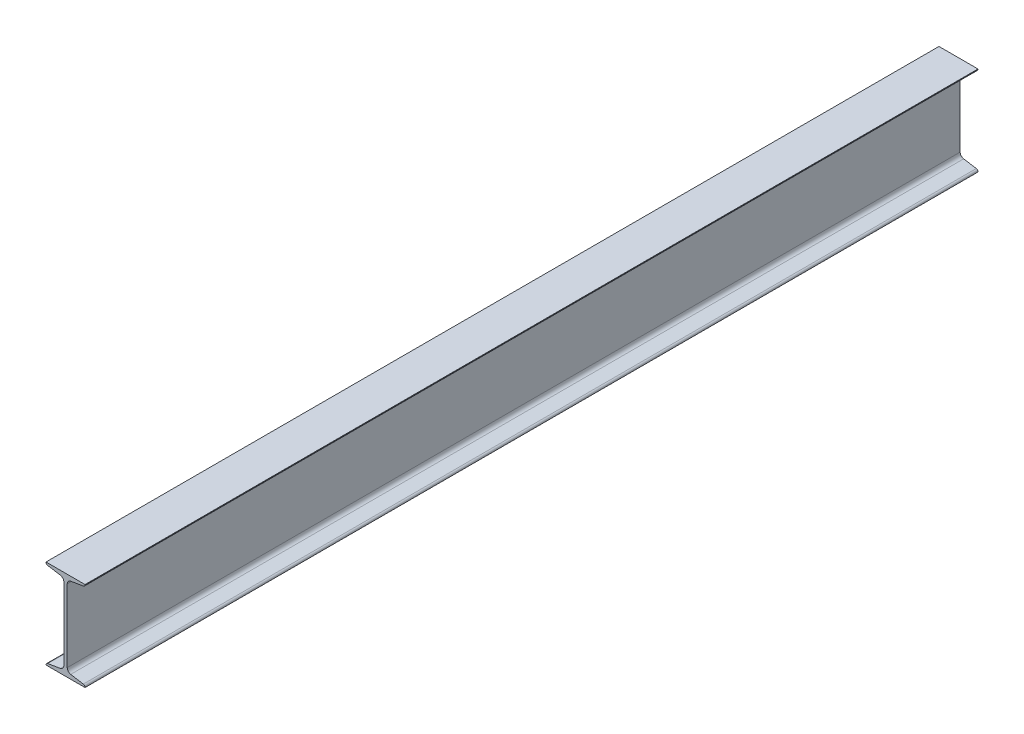
ISO-10303-21;
HEADER;
FILE_DESCRIPTION(('STEP AP214'),'2;1');
FILE_NAME('part.step','',(''),(''),'','','');
FILE_SCHEMA(('AUTOMOTIVE_DESIGN { 1 0 10303 214 1 1 1 1 }'));
ENDSEC;
DATA;
#1=APPLICATION_CONTEXT('core data for automotive mechanical design processes');
#2=APPLICATION_PROTOCOL_DEFINITION('international standard','automotive_design',2000,#1);
#3=PRODUCT_CONTEXT('',#1,'mechanical');
#4=PRODUCT('Part','Part','',(#3));
#5=PRODUCT_RELATED_PRODUCT_CATEGORY('part','',(#4));
#6=PRODUCT_DEFINITION_FORMATION('','',#4);
#7=PRODUCT_DEFINITION_CONTEXT('part definition',#1,'design');
#8=PRODUCT_DEFINITION('design','',#6,#7);
#9=PRODUCT_DEFINITION_SHAPE('','',#8);
#10=(LENGTH_UNIT() NAMED_UNIT(*) SI_UNIT(.MILLI.,.METRE.));
#11=(NAMED_UNIT(*) PLANE_ANGLE_UNIT() SI_UNIT($,.RADIAN.));
#12=(NAMED_UNIT(*) SI_UNIT($,.STERADIAN.) SOLID_ANGLE_UNIT());
#13=UNCERTAINTY_MEASURE_WITH_UNIT(LENGTH_MEASURE(1.E-05),#10,'distance_accuracy_value','');
#14=(GEOMETRIC_REPRESENTATION_CONTEXT(3) GLOBAL_UNCERTAINTY_ASSIGNED_CONTEXT((#13)) GLOBAL_UNIT_ASSIGNED_CONTEXT((#10,
#11,#12)) REPRESENTATION_CONTEXT('',''));
#15=CARTESIAN_POINT('',(0.,0.,0.));
#16=DIRECTION('',(0.,0.,1.));
#17=DIRECTION('',(1.,0.,0.));
#18=AXIS2_PLACEMENT_3D('',#15,#16,#17);
#19=CARTESIAN_POINT('',(66.6750000000003,-152.4,3050.));
#20=DIRECTION('',(0.,1.,0.));
#21=DIRECTION('',(-1.,0.,0.));
#22=AXIS2_PLACEMENT_3D('',#19,#20,#21);
#23=PLANE('',#22);
#24=DIRECTION('',(1.,0.,0.));
#25=VECTOR('',#24,1.);
#26=CARTESIAN_POINT('',(66.6750000000003,-152.4,0.));
#27=LINE('',#26,#25);
#28=CARTESIAN_POINT('',(-66.6749999999997,-152.4,0.));
#29=VERTEX_POINT('',#28);
#30=CARTESIAN_POINT('',(66.6750000000003,-152.4,0.));
#31=VERTEX_POINT('',#30);
#32=EDGE_CURVE('E209',#29,#31,#27,.T.);
#33=ORIENTED_EDGE('',*,*,#32,.T.);
#34=DIRECTION('',(0.,0.,-1.));
#35=VECTOR('',#34,1.);
#36=CARTESIAN_POINT('',(66.6750000000003,-152.4,3050.));
#37=LINE('',#36,#35);
#38=CARTESIAN_POINT('',(66.6750000000003,-152.4,3050.));
#39=VERTEX_POINT('',#38);
#40=EDGE_CURVE('E11',#39,#31,#37,.T.);
#41=ORIENTED_EDGE('',*,*,#40,.F.);
#42=DIRECTION('',(1.,0.,0.));
#43=VECTOR('',#42,1.);
#44=CARTESIAN_POINT('',(66.6750000000003,-152.4,3050.));
#45=LINE('',#44,#43);
#46=CARTESIAN_POINT('',(-66.6749999999997,-152.4,3050.));
#47=VERTEX_POINT('',#46);
#48=EDGE_CURVE('E247',#47,#39,#45,.T.);
#49=ORIENTED_EDGE('',*,*,#48,.F.);
#50=DIRECTION('',(0.,0.,-1.));
#51=VECTOR('',#50,1.);
#52=CARTESIAN_POINT('',(-66.6749999999997,-152.4,3050.));
#53=LINE('',#52,#51);
#54=EDGE_CURVE('E205',#47,#29,#53,.T.);
#55=ORIENTED_EDGE('',*,*,#54,.T.);
#56=EDGE_LOOP('',(#33,#41,#49,#55));
#57=FACE_BOUND('',#56,.T.);
#58=ADVANCED_FACE('F41',(#57),#23,.F.);
#59=CARTESIAN_POINT('',(66.6750000000003,-152.036345520012,3050.));
#60=DIRECTION('',(-1.,0.,0.));
#61=DIRECTION('',(0.,0.,1.));
#62=AXIS2_PLACEMENT_3D('',#59,#60,#61);
#63=PLANE('',#62);
#64=DIRECTION('',(0.,1.,0.));
#65=VECTOR('',#64,1.);
#66=CARTESIAN_POINT('',(66.6750000000003,-152.036345520012,0.));
#67=LINE('',#66,#65);
#68=CARTESIAN_POINT('',(66.6750000000003,-152.036345520012,0.));
#69=VERTEX_POINT('',#68);
#70=EDGE_CURVE('E212',#31,#69,#67,.T.);
#71=ORIENTED_EDGE('',*,*,#70,.T.);
#72=DIRECTION('',(0.,0.,-1.));
#73=VECTOR('',#72,1.);
#74=CARTESIAN_POINT('',(66.6750000000003,-152.036345520012,3050.));
#75=LINE('',#74,#73);
#76=CARTESIAN_POINT('',(66.6750000000003,-152.036345520012,3050.));
#77=VERTEX_POINT('',#76);
#78=EDGE_CURVE('E49',#77,#69,#75,.T.);
#79=ORIENTED_EDGE('',*,*,#78,.F.);
#80=DIRECTION('',(0.,1.,0.));
#81=VECTOR('',#80,1.);
#82=CARTESIAN_POINT('',(66.6750000000003,-152.036345520012,3050.));
#83=LINE('',#82,#81);
#84=EDGE_CURVE('E136',#39,#77,#83,.T.);
#85=ORIENTED_EDGE('',*,*,#84,.F.);
#86=ORIENTED_EDGE('',*,*,#40,.T.);
#87=EDGE_LOOP('',(#71,#79,#85,#86));
#88=FACE_BOUND('',#87,.T.);
#89=ADVANCED_FACE('F365',(#88),#63,.F.);
#90=CARTESIAN_POINT('',(59.5630000000004,-152.036345520012,3050.));
#91=DIRECTION('',(0.,0.,-1.));
#92=DIRECTION('',(-1.,0.,0.));
#93=AXIS2_PLACEMENT_3D('',#90,#91,#92);
#94=CYLINDRICAL_SURFACE('',#93,7.112);
#95=CARTESIAN_POINT('',(59.5630000000004,-152.036345520012,0.));
#96=DIRECTION('',(0.,0.,1.));
#97=DIRECTION('',(-1.,0.,0.));
#98=AXIS2_PLACEMENT_3D('',#95,#96,#97);
#99=CIRCLE('',#98,7.112);
#100=CARTESIAN_POINT('',(60.731921268104,-145.021064551371,0.));
#101=VERTEX_POINT('',#100);
#102=EDGE_CURVE('E214',#69,#101,#99,.T.);
#103=ORIENTED_EDGE('',*,*,#102,.T.);
#104=DIRECTION('',(0.,0.,-1.));
#105=VECTOR('',#104,1.);
#106=CARTESIAN_POINT('',(60.731921268104,-145.021064551371,3050.));
#107=LINE('',#106,#105);
#108=CARTESIAN_POINT('',(60.731921268104,-145.021064551371,3050.));
#109=VERTEX_POINT('',#108);
#110=EDGE_CURVE('E290',#109,#101,#107,.T.);
#111=ORIENTED_EDGE('',*,*,#110,.F.);
#112=CARTESIAN_POINT('',(59.5630000000004,-152.036345520012,3050.));
#113=DIRECTION('',(0.,0.,1.));
#114=DIRECTION('',(-1.,0.,0.));
#115=AXIS2_PLACEMENT_3D('',#112,#113,#114);
#116=CIRCLE('',#115,7.112);
#117=EDGE_CURVE('E298',#77,#109,#116,.T.);
#118=ORIENTED_EDGE('',*,*,#117,.F.);
#119=ORIENTED_EDGE('',*,*,#78,.T.);
#120=EDGE_LOOP('',(#103,#111,#118,#119));
#121=FACE_BOUND('',#120,.T.);
#122=ADVANCED_FACE('F296',(#121),#94,.T.);
#123=CARTESIAN_POINT('',(17.7281574637928,-137.855561937282,3050.));
#124=DIRECTION('',(-0.164359008451028,-0.986400586141855,0.));
#125=DIRECTION('',(0.986400586141855,-0.164359008451028,0.));
#126=AXIS2_PLACEMENT_3D('',#123,#124,#125);
#127=PLANE('',#126);
#128=DIRECTION('',(-0.986400586141855,0.164359008451028,0.));
#129=VECTOR('',#128,1.);
#130=CARTESIAN_POINT('',(17.7281574637928,-137.855561937282,0.));
#131=LINE('',#130,#129);
#132=CARTESIAN_POINT('',(17.7281574637928,-137.855561937282,0.));
#133=VERTEX_POINT('',#132);
#134=EDGE_CURVE('E216',#101,#133,#131,.T.);
#135=ORIENTED_EDGE('',*,*,#134,.T.);
#136=DIRECTION('',(0.,0.,-1.));
#137=VECTOR('',#136,1.);
#138=CARTESIAN_POINT('',(17.7281574637928,-137.855561937282,3050.));
#139=LINE('',#138,#137);
#140=CARTESIAN_POINT('',(17.7281574637928,-137.855561937282,3050.));
#141=VERTEX_POINT('',#140);
#142=EDGE_CURVE('E287',#141,#133,#139,.T.);
#143=ORIENTED_EDGE('',*,*,#142,.F.);
#144=DIRECTION('',(-0.986400586141855,0.164359008451028,0.));
#145=VECTOR('',#144,1.);
#146=CARTESIAN_POINT('',(17.7281574637928,-137.855561937282,3050.));
#147=LINE('',#146,#145);
#148=EDGE_CURVE('E316',#109,#141,#147,.T.);
#149=ORIENTED_EDGE('',*,*,#148,.F.);
#150=ORIENTED_EDGE('',*,*,#110,.T.);
#151=EDGE_LOOP('',(#135,#143,#149,#150));
#152=FACE_BOUND('',#151,.T.);
#153=ADVANCED_FACE('F307',(#152),#127,.F.);
#154=CARTESIAN_POINT('',(20.0660000000003,-123.825,3050.));
#155=DIRECTION('',(0.,0.,-1.));
#156=DIRECTION('',(-1.,0.,0.));
#157=AXIS2_PLACEMENT_3D('',#154,#155,#156);
#158=CYLINDRICAL_SURFACE('',#157,14.224);
#159=CARTESIAN_POINT('',(20.0660000000003,-123.825,0.));
#160=DIRECTION('',(0.,0.,-1.));
#161=DIRECTION('',(1.,0.,0.));
#162=AXIS2_PLACEMENT_3D('',#159,#160,#161);
#163=CIRCLE('',#162,14.224);
#164=CARTESIAN_POINT('',(5.84200000000027,-123.825,0.));
#165=VERTEX_POINT('',#164);
#166=EDGE_CURVE('E218',#133,#165,#163,.T.);
#167=ORIENTED_EDGE('',*,*,#166,.T.);
#168=DIRECTION('',(0.,0.,-1.));
#169=VECTOR('',#168,1.);
#170=CARTESIAN_POINT('',(5.84200000000027,-123.825,3050.));
#171=LINE('',#170,#169);
#172=CARTESIAN_POINT('',(5.84200000000027,-123.825,3050.));
#173=VERTEX_POINT('',#172);
#174=EDGE_CURVE('E284',#173,#165,#171,.T.);
#175=ORIENTED_EDGE('',*,*,#174,.F.);
#176=CARTESIAN_POINT('',(20.0660000000003,-123.825,3050.));
#177=DIRECTION('',(0.,0.,-1.));
#178=DIRECTION('',(1.,0.,0.));
#179=AXIS2_PLACEMENT_3D('',#176,#177,#178);
#180=CIRCLE('',#179,14.224);
#181=EDGE_CURVE('E313',#141,#173,#180,.T.);
#182=ORIENTED_EDGE('',*,*,#181,.F.);
#183=ORIENTED_EDGE('',*,*,#142,.T.);
#184=EDGE_LOOP('',(#167,#175,#182,#183));
#185=FACE_BOUND('',#184,.T.);
#186=ADVANCED_FACE('F311',(#185),#158,.F.);
#187=CARTESIAN_POINT('',(5.84199999999973,123.825,3050.));
#188=DIRECTION('',(-1.,0.,0.));
#189=DIRECTION('',(0.,-1.,0.));
#190=AXIS2_PLACEMENT_3D('',#187,#188,#189);
#191=PLANE('',#190);
#192=DIRECTION('',(0.,1.,0.));
#193=VECTOR('',#192,1.);
#194=CARTESIAN_POINT('',(5.84199999999973,123.825,0.));
#195=LINE('',#194,#193);
#196=CARTESIAN_POINT('',(5.84199999999972,123.825,0.));
#197=VERTEX_POINT('',#196);
#198=EDGE_CURVE('E220',#165,#197,#195,.T.);
#199=ORIENTED_EDGE('',*,*,#198,.T.);
#200=DIRECTION('',(0.,0.,-1.));
#201=VECTOR('',#200,1.);
#202=CARTESIAN_POINT('',(5.84199999999972,123.825,3050.));
#203=LINE('',#202,#201);
#204=CARTESIAN_POINT('',(5.84199999999972,123.825,3050.));
#205=VERTEX_POINT('',#204);
#206=EDGE_CURVE('E281',#205,#197,#203,.T.);
#207=ORIENTED_EDGE('',*,*,#206,.F.);
#208=DIRECTION('',(0.,1.,0.));
#209=VECTOR('',#208,1.);
#210=CARTESIAN_POINT('',(5.84199999999973,123.825,3050.));
#211=LINE('',#210,#209);
#212=EDGE_CURVE('E315',#173,#205,#211,.T.);
#213=ORIENTED_EDGE('',*,*,#212,.F.);
#214=ORIENTED_EDGE('',*,*,#174,.T.);
#215=EDGE_LOOP('',(#199,#207,#213,#214));
#216=FACE_BOUND('',#215,.T.);
#217=ADVANCED_FACE('F378',(#216),#191,.F.);
#218=CARTESIAN_POINT('',(20.0659999999997,123.825,3050.));
#219=DIRECTION('',(0.,0.,-1.));
#220=DIRECTION('',(-1.,0.,0.));
#221=AXIS2_PLACEMENT_3D('',#218,#219,#220);
#222=CYLINDRICAL_SURFACE('',#221,14.224);
#223=CARTESIAN_POINT('',(20.0659999999997,123.825,0.));
#224=DIRECTION('',(0.,0.,-1.));
#225=DIRECTION('',(1.,0.,0.));
#226=AXIS2_PLACEMENT_3D('',#223,#224,#225);
#227=CIRCLE('',#226,14.224);
#228=CARTESIAN_POINT('',(17.7281574637922,137.855561937282,0.));
#229=VERTEX_POINT('',#228);
#230=EDGE_CURVE('E222',#197,#229,#227,.T.);
#231=ORIENTED_EDGE('',*,*,#230,.T.);
#232=DIRECTION('',(0.,0.,-1.));
#233=VECTOR('',#232,1.);
#234=CARTESIAN_POINT('',(17.7281574637922,137.855561937282,3050.));
#235=LINE('',#234,#233);
#236=CARTESIAN_POINT('',(17.7281574637922,137.855561937282,3050.));
#237=VERTEX_POINT('',#236);
#238=EDGE_CURVE('E278',#237,#229,#235,.T.);
#239=ORIENTED_EDGE('',*,*,#238,.F.);
#240=CARTESIAN_POINT('',(20.0659999999997,123.825,3050.));
#241=DIRECTION('',(0.,0.,-1.));
#242=DIRECTION('',(1.,0.,0.));
#243=AXIS2_PLACEMENT_3D('',#240,#241,#242);
#244=CIRCLE('',#243,14.224);
#245=EDGE_CURVE('E318',#205,#237,#244,.T.);
#246=ORIENTED_EDGE('',*,*,#245,.F.);
#247=ORIENTED_EDGE('',*,*,#206,.T.);
#248=EDGE_LOOP('',(#231,#239,#246,#247));
#249=FACE_BOUND('',#248,.T.);
#250=ADVANCED_FACE('F381',(#249),#222,.F.);
#251=CARTESIAN_POINT('',(60.7319212681034,145.021064551371,3050.));
#252=DIRECTION('',(-0.164359008451033,0.986400586141854,0.));
#253=DIRECTION('',(-0.986400586141854,-0.164359008451033,0.));
#254=AXIS2_PLACEMENT_3D('',#251,#252,#253);
#255=PLANE('',#254);
#256=DIRECTION('',(0.986400586141854,0.164359008451033,0.));
#257=VECTOR('',#256,1.);
#258=CARTESIAN_POINT('',(60.7319212681034,145.021064551371,0.));
#259=LINE('',#258,#257);
#260=CARTESIAN_POINT('',(60.7319212681034,145.021064551371,0.));
#261=VERTEX_POINT('',#260);
#262=EDGE_CURVE('E224',#229,#261,#259,.T.);
#263=ORIENTED_EDGE('',*,*,#262,.T.);
#264=DIRECTION('',(0.,0.,-1.));
#265=VECTOR('',#264,1.);
#266=CARTESIAN_POINT('',(60.7319212681034,145.021064551371,3050.));
#267=LINE('',#266,#265);
#268=CARTESIAN_POINT('',(60.7319212681034,145.021064551371,3050.));
#269=VERTEX_POINT('',#268);
#270=EDGE_CURVE('E275',#269,#261,#267,.T.);
#271=ORIENTED_EDGE('',*,*,#270,.F.);
#272=DIRECTION('',(0.986400586141854,0.164359008451033,0.));
#273=VECTOR('',#272,1.);
#274=CARTESIAN_POINT('',(60.7319212681034,145.021064551371,3050.));
#275=LINE('',#274,#273);
#276=EDGE_CURVE('E324',#237,#269,#275,.T.);
#277=ORIENTED_EDGE('',*,*,#276,.F.);
#278=ORIENTED_EDGE('',*,*,#238,.T.);
#279=EDGE_LOOP('',(#263,#271,#277,#278));
#280=FACE_BOUND('',#279,.T.);
#281=ADVANCED_FACE('F385',(#280),#255,.F.);
#282=CARTESIAN_POINT('',(59.5629999999997,152.036345520012,3050.));
#283=DIRECTION('',(0.,0.,-1.));
#284=DIRECTION('',(-1.,0.,0.));
#285=AXIS2_PLACEMENT_3D('',#282,#283,#284);
#286=CYLINDRICAL_SURFACE('',#285,7.112);
#287=CARTESIAN_POINT('',(59.5629999999997,152.036345520012,0.));
#288=DIRECTION('',(0.,0.,1.));
#289=DIRECTION('',(1.,0.,0.));
#290=AXIS2_PLACEMENT_3D('',#287,#288,#289);
#291=CIRCLE('',#290,7.112);
#292=CARTESIAN_POINT('',(66.6749999999997,152.036345520012,0.));
#293=VERTEX_POINT('',#292);
#294=EDGE_CURVE('E226',#261,#293,#291,.T.);
#295=ORIENTED_EDGE('',*,*,#294,.T.);
#296=DIRECTION('',(0.,0.,-1.));
#297=VECTOR('',#296,1.);
#298=CARTESIAN_POINT('',(66.6749999999997,152.036345520012,3050.));
#299=LINE('',#298,#297);
#300=CARTESIAN_POINT('',(66.6749999999997,152.036345520012,3050.));
#301=VERTEX_POINT('',#300);
#302=EDGE_CURVE('E272',#301,#293,#299,.T.);
#303=ORIENTED_EDGE('',*,*,#302,.F.);
#304=CARTESIAN_POINT('',(59.5629999999997,152.036345520012,3050.));
#305=DIRECTION('',(0.,0.,1.));
#306=DIRECTION('',(1.,0.,0.));
#307=AXIS2_PLACEMENT_3D('',#304,#305,#306);
#308=CIRCLE('',#307,7.112);
#309=EDGE_CURVE('E326',#269,#301,#308,.T.);
#310=ORIENTED_EDGE('',*,*,#309,.F.);
#311=ORIENTED_EDGE('',*,*,#270,.T.);
#312=EDGE_LOOP('',(#295,#303,#310,#311));
#313=FACE_BOUND('',#312,.T.);
#314=ADVANCED_FACE('F389',(#313),#286,.T.);
#315=CARTESIAN_POINT('',(66.6749999999997,152.4,3050.));
#316=DIRECTION('',(-1.,0.,0.));
#317=DIRECTION('',(0.,0.,1.));
#318=AXIS2_PLACEMENT_3D('',#315,#316,#317);
#319=PLANE('',#318);
#320=DIRECTION('',(0.,1.,0.));
#321=VECTOR('',#320,1.);
#322=CARTESIAN_POINT('',(66.6749999999997,152.4,0.));
#323=LINE('',#322,#321);
#324=CARTESIAN_POINT('',(66.6749999999997,152.4,0.));
#325=VERTEX_POINT('',#324);
#326=EDGE_CURVE('E228',#293,#325,#323,.T.);
#327=ORIENTED_EDGE('',*,*,#326,.T.);
#328=DIRECTION('',(0.,0.,-1.));
#329=VECTOR('',#328,1.);
#330=CARTESIAN_POINT('',(66.6749999999997,152.4,3050.));
#331=LINE('',#330,#329);
#332=CARTESIAN_POINT('',(66.6749999999997,152.4,3050.));
#333=VERTEX_POINT('',#332);
#334=EDGE_CURVE('E269',#333,#325,#331,.T.);
#335=ORIENTED_EDGE('',*,*,#334,.F.);
#336=DIRECTION('',(0.,1.,0.));
#337=VECTOR('',#336,1.);
#338=CARTESIAN_POINT('',(66.6749999999997,152.4,3050.));
#339=LINE('',#338,#337);
#340=EDGE_CURVE('E328',#301,#333,#339,.T.);
#341=ORIENTED_EDGE('',*,*,#340,.F.);
#342=ORIENTED_EDGE('',*,*,#302,.T.);
#343=EDGE_LOOP('',(#327,#335,#341,#342));
#344=FACE_BOUND('',#343,.T.);
#345=ADVANCED_FACE('F393',(#344),#319,.F.);
#346=CARTESIAN_POINT('',(-66.6750000000003,152.4,3050.));
#347=DIRECTION('',(0.,-1.,0.));
#348=DIRECTION('',(1.,0.,0.));
#349=AXIS2_PLACEMENT_3D('',#346,#347,#348);
#350=PLANE('',#349);
#351=DIRECTION('',(-1.,0.,0.));
#352=VECTOR('',#351,1.);
#353=CARTESIAN_POINT('',(-66.6750000000003,152.4,0.));
#354=LINE('',#353,#352);
#355=CARTESIAN_POINT('',(-66.6750000000003,152.4,0.));
#356=VERTEX_POINT('',#355);
#357=EDGE_CURVE('E230',#325,#356,#354,.T.);
#358=ORIENTED_EDGE('',*,*,#357,.T.);
#359=DIRECTION('',(0.,0.,-1.));
#360=VECTOR('',#359,1.);
#361=CARTESIAN_POINT('',(-66.6750000000003,152.4,3050.));
#362=LINE('',#361,#360);
#363=CARTESIAN_POINT('',(-66.6750000000003,152.4,3050.));
#364=VERTEX_POINT('',#363);
#365=EDGE_CURVE('E266',#364,#356,#362,.T.);
#366=ORIENTED_EDGE('',*,*,#365,.F.);
#367=DIRECTION('',(-1.,0.,0.));
#368=VECTOR('',#367,1.);
#369=CARTESIAN_POINT('',(-66.6750000000003,152.4,3050.));
#370=LINE('',#369,#368);
#371=EDGE_CURVE('E330',#333,#364,#370,.T.);
#372=ORIENTED_EDGE('',*,*,#371,.F.);
#373=ORIENTED_EDGE('',*,*,#334,.T.);
#374=EDGE_LOOP('',(#358,#366,#372,#373));
#375=FACE_BOUND('',#374,.T.);
#376=ADVANCED_FACE('F397',(#375),#350,.F.);
#377=CARTESIAN_POINT('',(-66.6750000000003,152.036345520012,3050.));
#378=DIRECTION('',(1.,0.,0.));
#379=DIRECTION('',(0.,0.,-1.));
#380=AXIS2_PLACEMENT_3D('',#377,#378,#379);
#381=PLANE('',#380);
#382=DIRECTION('',(0.,-1.,0.));
#383=VECTOR('',#382,1.);
#384=CARTESIAN_POINT('',(-66.6750000000003,152.036345520012,0.));
#385=LINE('',#384,#383);
#386=CARTESIAN_POINT('',(-66.6750000000003,152.036345520012,0.));
#387=VERTEX_POINT('',#386);
#388=EDGE_CURVE('E232',#356,#387,#385,.T.);
#389=ORIENTED_EDGE('',*,*,#388,.T.);
#390=DIRECTION('',(0.,0.,-1.));
#391=VECTOR('',#390,1.);
#392=CARTESIAN_POINT('',(-66.6750000000003,152.036345520012,3050.));
#393=LINE('',#392,#391);
#394=CARTESIAN_POINT('',(-66.6750000000003,152.036345520012,3050.));
#395=VERTEX_POINT('',#394);
#396=EDGE_CURVE('E263',#395,#387,#393,.T.);
#397=ORIENTED_EDGE('',*,*,#396,.F.);
#398=DIRECTION('',(0.,-1.,0.));
#399=VECTOR('',#398,1.);
#400=CARTESIAN_POINT('',(-66.6750000000003,152.036345520012,3050.));
#401=LINE('',#400,#399);
#402=EDGE_CURVE('E332',#364,#395,#401,.T.);
#403=ORIENTED_EDGE('',*,*,#402,.F.);
#404=ORIENTED_EDGE('',*,*,#365,.T.);
#405=EDGE_LOOP('',(#389,#397,#403,#404));
#406=FACE_BOUND('',#405,.T.);
#407=ADVANCED_FACE('F401',(#406),#381,.F.);
#408=CARTESIAN_POINT('',(-59.5630000000003,152.036345520012,3050.));
#409=DIRECTION('',(0.,0.,-1.));
#410=DIRECTION('',(-1.,0.,0.));
#411=AXIS2_PLACEMENT_3D('',#408,#409,#410);
#412=CYLINDRICAL_SURFACE('',#411,7.11200000000001);
#413=CARTESIAN_POINT('',(-59.5630000000003,152.036345520012,0.));
#414=DIRECTION('',(0.,0.,1.));
#415=DIRECTION('',(-1.,0.,0.));
#416=AXIS2_PLACEMENT_3D('',#413,#414,#415);
#417=CIRCLE('',#416,7.11200000000001);
#418=CARTESIAN_POINT('',(-60.731921268104,145.021064551371,0.));
#419=VERTEX_POINT('',#418);
#420=EDGE_CURVE('E234',#387,#419,#417,.T.);
#421=ORIENTED_EDGE('',*,*,#420,.T.);
#422=DIRECTION('',(0.,0.,-1.));
#423=VECTOR('',#422,1.);
#424=CARTESIAN_POINT('',(-60.731921268104,145.021064551371,3050.));
#425=LINE('',#424,#423);
#426=CARTESIAN_POINT('',(-60.731921268104,145.021064551371,3050.));
#427=VERTEX_POINT('',#426);
#428=EDGE_CURVE('E260',#427,#419,#425,.T.);
#429=ORIENTED_EDGE('',*,*,#428,.F.);
#430=CARTESIAN_POINT('',(-59.5630000000003,152.036345520012,3050.));
#431=DIRECTION('',(0.,0.,1.));
#432=DIRECTION('',(-1.,0.,0.));
#433=AXIS2_PLACEMENT_3D('',#430,#431,#432);
#434=CIRCLE('',#433,7.11200000000001);
#435=EDGE_CURVE('E334',#395,#427,#434,.T.);
#436=ORIENTED_EDGE('',*,*,#435,.F.);
#437=ORIENTED_EDGE('',*,*,#396,.T.);
#438=EDGE_LOOP('',(#421,#429,#436,#437));
#439=FACE_BOUND('',#438,.T.);
#440=ADVANCED_FACE('F405',(#439),#412,.T.);
#441=CARTESIAN_POINT('',(-17.7281574637928,137.855561937282,3050.));
#442=DIRECTION('',(0.16435900845103,0.986400586141855,0.));
#443=DIRECTION('',(-0.986400586141855,0.16435900845103,0.));
#444=AXIS2_PLACEMENT_3D('',#441,#442,#443);
#445=PLANE('',#444);
#446=DIRECTION('',(0.986400586141855,-0.16435900845103,0.));
#447=VECTOR('',#446,1.);
#448=CARTESIAN_POINT('',(-17.7281574637928,137.855561937282,0.));
#449=LINE('',#448,#447);
#450=CARTESIAN_POINT('',(-17.7281574637928,137.855561937282,0.));
#451=VERTEX_POINT('',#450);
#452=EDGE_CURVE('E236',#419,#451,#449,.T.);
#453=ORIENTED_EDGE('',*,*,#452,.T.);
#454=DIRECTION('',(0.,0.,-1.));
#455=VECTOR('',#454,1.);
#456=CARTESIAN_POINT('',(-17.7281574637928,137.855561937282,3050.));
#457=LINE('',#456,#455);
#458=CARTESIAN_POINT('',(-17.7281574637928,137.855561937282,3050.));
#459=VERTEX_POINT('',#458);
#460=EDGE_CURVE('E257',#459,#451,#457,.T.);
#461=ORIENTED_EDGE('',*,*,#460,.F.);
#462=DIRECTION('',(0.986400586141855,-0.16435900845103,0.));
#463=VECTOR('',#462,1.);
#464=CARTESIAN_POINT('',(-17.7281574637928,137.855561937282,3050.));
#465=LINE('',#464,#463);
#466=EDGE_CURVE('E336',#427,#459,#465,.T.);
#467=ORIENTED_EDGE('',*,*,#466,.F.);
#468=ORIENTED_EDGE('',*,*,#428,.T.);
#469=EDGE_LOOP('',(#453,#461,#467,#468));
#470=FACE_BOUND('',#469,.T.);
#471=ADVANCED_FACE('F409',(#470),#445,.F.);
#472=CARTESIAN_POINT('',(-20.0660000000003,123.825,3050.));
#473=DIRECTION('',(0.,0.,-1.));
#474=DIRECTION('',(-1.,0.,0.));
#475=AXIS2_PLACEMENT_3D('',#472,#473,#474);
#476=CYLINDRICAL_SURFACE('',#475,14.224);
#477=CARTESIAN_POINT('',(-20.0660000000003,123.825,0.));
#478=DIRECTION('',(0.,0.,-1.));
#479=DIRECTION('',(1.,0.,0.));
#480=AXIS2_PLACEMENT_3D('',#477,#478,#479);
#481=CIRCLE('',#480,14.224);
#482=CARTESIAN_POINT('',(-5.84200000000027,123.825,0.));
#483=VERTEX_POINT('',#482);
#484=EDGE_CURVE('E238',#451,#483,#481,.T.);
#485=ORIENTED_EDGE('',*,*,#484,.T.);
#486=DIRECTION('',(0.,0.,-1.));
#487=VECTOR('',#486,1.);
#488=CARTESIAN_POINT('',(-5.84200000000027,123.825,3050.));
#489=LINE('',#488,#487);
#490=CARTESIAN_POINT('',(-5.84200000000027,123.825,3050.));
#491=VERTEX_POINT('',#490);
#492=EDGE_CURVE('E254',#491,#483,#489,.T.);
#493=ORIENTED_EDGE('',*,*,#492,.F.);
#494=CARTESIAN_POINT('',(-20.0660000000003,123.825,3050.));
#495=DIRECTION('',(0.,0.,-1.));
#496=DIRECTION('',(1.,0.,0.));
#497=AXIS2_PLACEMENT_3D('',#494,#495,#496);
#498=CIRCLE('',#497,14.224);
#499=EDGE_CURVE('E338',#459,#491,#498,.T.);
#500=ORIENTED_EDGE('',*,*,#499,.F.);
#501=ORIENTED_EDGE('',*,*,#460,.T.);
#502=EDGE_LOOP('',(#485,#493,#500,#501));
#503=FACE_BOUND('',#502,.T.);
#504=ADVANCED_FACE('F413',(#503),#476,.F.);
#505=CARTESIAN_POINT('',(-5.84199999999973,-123.825,3050.));
#506=DIRECTION('',(1.,0.,0.));
#507=DIRECTION('',(0.,1.,0.));
#508=AXIS2_PLACEMENT_3D('',#505,#506,#507);
#509=PLANE('',#508);
#510=DIRECTION('',(0.,-1.,0.));
#511=VECTOR('',#510,1.);
#512=CARTESIAN_POINT('',(-5.84199999999973,-123.825,0.));
#513=LINE('',#512,#511);
#514=CARTESIAN_POINT('',(-5.84199999999973,-123.825,0.));
#515=VERTEX_POINT('',#514);
#516=EDGE_CURVE('E240',#483,#515,#513,.T.);
#517=ORIENTED_EDGE('',*,*,#516,.T.);
#518=DIRECTION('',(0.,0.,-1.));
#519=VECTOR('',#518,1.);
#520=CARTESIAN_POINT('',(-5.84199999999973,-123.825,3050.));
#521=LINE('',#520,#519);
#522=CARTESIAN_POINT('',(-5.84199999999973,-123.825,3050.));
#523=VERTEX_POINT('',#522);
#524=EDGE_CURVE('E251',#523,#515,#521,.T.);
#525=ORIENTED_EDGE('',*,*,#524,.F.);
#526=DIRECTION('',(0.,-1.,0.));
#527=VECTOR('',#526,1.);
#528=CARTESIAN_POINT('',(-5.84199999999973,-123.825,3050.));
#529=LINE('',#528,#527);
#530=EDGE_CURVE('E340',#491,#523,#529,.T.);
#531=ORIENTED_EDGE('',*,*,#530,.F.);
#532=ORIENTED_EDGE('',*,*,#492,.T.);
#533=EDGE_LOOP('',(#517,#525,#531,#532));
#534=FACE_BOUND('',#533,.T.);
#535=ADVANCED_FACE('F346',(#534),#509,.F.);
#536=CARTESIAN_POINT('',(-20.0659999999997,-123.825,3050.));
#537=DIRECTION('',(0.,0.,-1.));
#538=DIRECTION('',(-1.,0.,0.));
#539=AXIS2_PLACEMENT_3D('',#536,#537,#538);
#540=CYLINDRICAL_SURFACE('',#539,14.224);
#541=CARTESIAN_POINT('',(-20.0659999999997,-123.825,0.));
#542=DIRECTION('',(0.,0.,-1.));
#543=DIRECTION('',(1.,0.,0.));
#544=AXIS2_PLACEMENT_3D('',#541,#542,#543);
#545=CIRCLE('',#544,14.224);
#546=CARTESIAN_POINT('',(-17.7281574637922,-137.855561937282,0.));
#547=VERTEX_POINT('',#546);
#548=EDGE_CURVE('E242',#515,#547,#545,.T.);
#549=ORIENTED_EDGE('',*,*,#548,.T.);
#550=DIRECTION('',(0.,0.,-1.));
#551=VECTOR('',#550,1.);
#552=CARTESIAN_POINT('',(-17.7281574637922,-137.855561937282,3050.));
#553=LINE('',#552,#551);
#554=CARTESIAN_POINT('',(-17.7281574637922,-137.855561937282,3050.));
#555=VERTEX_POINT('',#554);
#556=EDGE_CURVE('E200',#555,#547,#553,.T.);
#557=ORIENTED_EDGE('',*,*,#556,.F.);
#558=CARTESIAN_POINT('',(-20.0659999999997,-123.825,3050.));
#559=DIRECTION('',(0.,0.,-1.));
#560=DIRECTION('',(1.,0.,0.));
#561=AXIS2_PLACEMENT_3D('',#558,#559,#560);
#562=CIRCLE('',#561,14.224);
#563=EDGE_CURVE('E191',#523,#555,#562,.T.);
#564=ORIENTED_EDGE('',*,*,#563,.F.);
#565=ORIENTED_EDGE('',*,*,#524,.T.);
#566=EDGE_LOOP('',(#549,#557,#564,#565));
#567=FACE_BOUND('',#566,.T.);
#568=ADVANCED_FACE('F350',(#567),#540,.F.);
#569=CARTESIAN_POINT('',(-60.7319212681034,-145.021064551371,3050.));
#570=DIRECTION('',(0.164359008451033,-0.986400586141854,0.));
#571=DIRECTION('',(0.986400586141854,0.164359008451033,0.));
#572=AXIS2_PLACEMENT_3D('',#569,#570,#571);
#573=PLANE('',#572);
#574=DIRECTION('',(-0.986400586141854,-0.164359008451033,0.));
#575=VECTOR('',#574,1.);
#576=CARTESIAN_POINT('',(-60.7319212681034,-145.021064551371,0.));
#577=LINE('',#576,#575);
#578=CARTESIAN_POINT('',(-60.7319212681034,-145.021064551371,0.));
#579=VERTEX_POINT('',#578);
#580=EDGE_CURVE('E199',#547,#579,#577,.T.);
#581=ORIENTED_EDGE('',*,*,#580,.T.);
#582=DIRECTION('',(0.,0.,-1.));
#583=VECTOR('',#582,1.);
#584=CARTESIAN_POINT('',(-60.7319212681034,-145.021064551371,3050.));
#585=LINE('',#584,#583);
#586=CARTESIAN_POINT('',(-60.7319212681034,-145.021064551371,3050.));
#587=VERTEX_POINT('',#586);
#588=EDGE_CURVE('E196',#587,#579,#585,.T.);
#589=ORIENTED_EDGE('',*,*,#588,.F.);
#590=DIRECTION('',(-0.986400586141854,-0.164359008451033,0.));
#591=VECTOR('',#590,1.);
#592=CARTESIAN_POINT('',(-60.7319212681034,-145.021064551371,3050.));
#593=LINE('',#592,#591);
#594=EDGE_CURVE('E185',#555,#587,#593,.T.);
#595=ORIENTED_EDGE('',*,*,#594,.F.);
#596=ORIENTED_EDGE('',*,*,#556,.T.);
#597=EDGE_LOOP('',(#581,#589,#595,#596));
#598=FACE_BOUND('',#597,.T.);
#599=ADVANCED_FACE('F197',(#598),#573,.F.);
#600=CARTESIAN_POINT('',(-59.5629999999997,-152.036345520012,3050.));
#601=DIRECTION('',(0.,0.,-1.));
#602=DIRECTION('',(-1.,0.,0.));
#603=AXIS2_PLACEMENT_3D('',#600,#601,#602);
#604=CYLINDRICAL_SURFACE('',#603,7.112);
#605=CARTESIAN_POINT('',(-59.5629999999997,-152.036345520012,0.));
#606=DIRECTION('',(0.,0.,1.));
#607=DIRECTION('',(1.,0.,0.));
#608=AXIS2_PLACEMENT_3D('',#605,#606,#607);
#609=CIRCLE('',#608,7.112);
#610=CARTESIAN_POINT('',(-66.6749999999997,-152.036345520012,0.));
#611=VERTEX_POINT('',#610);
#612=EDGE_CURVE('E122',#579,#611,#609,.T.);
#613=ORIENTED_EDGE('',*,*,#612,.T.);
#614=DIRECTION('',(0.,0.,-1.));
#615=VECTOR('',#614,1.);
#616=CARTESIAN_POINT('',(-66.6749999999997,-152.036345520012,3050.));
#617=LINE('',#616,#615);
#618=CARTESIAN_POINT('',(-66.6749999999997,-152.036345520012,3050.));
#619=VERTEX_POINT('',#618);
#620=EDGE_CURVE('E201',#619,#611,#617,.T.);
#621=ORIENTED_EDGE('',*,*,#620,.F.);
#622=CARTESIAN_POINT('',(-59.5629999999997,-152.036345520012,3050.));
#623=DIRECTION('',(0.,0.,1.));
#624=DIRECTION('',(1.,0.,0.));
#625=AXIS2_PLACEMENT_3D('',#622,#623,#624);
#626=CIRCLE('',#625,7.112);
#627=EDGE_CURVE('E189',#587,#619,#626,.T.);
#628=ORIENTED_EDGE('',*,*,#627,.F.);
#629=ORIENTED_EDGE('',*,*,#588,.T.);
#630=EDGE_LOOP('',(#613,#621,#628,#629));
#631=FACE_BOUND('',#630,.T.);
#632=ADVANCED_FACE('F203',(#631),#604,.T.);
#633=CARTESIAN_POINT('',(-66.6749999999997,-152.4,3050.));
#634=DIRECTION('',(1.,0.,0.));
#635=DIRECTION('',(0.,1.,0.));
#636=AXIS2_PLACEMENT_3D('',#633,#634,#635);
#637=PLANE('',#636);
#638=DIRECTION('',(0.,-1.,0.));
#639=VECTOR('',#638,1.);
#640=CARTESIAN_POINT('',(-66.6749999999997,-152.4,0.));
#641=LINE('',#640,#639);
#642=EDGE_CURVE('E128',#611,#29,#641,.T.);
#643=ORIENTED_EDGE('',*,*,#642,.T.);
#644=ORIENTED_EDGE('',*,*,#54,.F.);
#645=DIRECTION('',(0.,-1.,0.));
#646=VECTOR('',#645,1.);
#647=CARTESIAN_POINT('',(-66.6749999999997,-152.4,3050.));
#648=LINE('',#647,#646);
#649=EDGE_CURVE('E57',#619,#47,#648,.T.);
#650=ORIENTED_EDGE('',*,*,#649,.F.);
#651=ORIENTED_EDGE('',*,*,#620,.T.);
#652=EDGE_LOOP('',(#643,#644,#650,#651));
#653=FACE_BOUND('',#652,.T.);
#654=ADVANCED_FACE('F354',(#653),#637,.F.);
#655=CARTESIAN_POINT('',(-59.5629999999997,-152.036345520012,3050.));
#656=DIRECTION('',(0.,0.,1.));
#657=DIRECTION('',(1.,0.,0.));
#658=AXIS2_PLACEMENT_3D('',#655,#656,#657);
#659=PLANE('',#658);
#660=ORIENTED_EDGE('',*,*,#48,.T.);
#661=ORIENTED_EDGE('',*,*,#84,.T.);
#662=ORIENTED_EDGE('',*,*,#117,.T.);
#663=ORIENTED_EDGE('',*,*,#148,.T.);
#664=ORIENTED_EDGE('',*,*,#181,.T.);
#665=ORIENTED_EDGE('',*,*,#212,.T.);
#666=ORIENTED_EDGE('',*,*,#245,.T.);
#667=ORIENTED_EDGE('',*,*,#276,.T.);
#668=ORIENTED_EDGE('',*,*,#309,.T.);
#669=ORIENTED_EDGE('',*,*,#340,.T.);
#670=ORIENTED_EDGE('',*,*,#371,.T.);
#671=ORIENTED_EDGE('',*,*,#402,.T.);
#672=ORIENTED_EDGE('',*,*,#435,.T.);
#673=ORIENTED_EDGE('',*,*,#466,.T.);
#674=ORIENTED_EDGE('',*,*,#499,.T.);
#675=ORIENTED_EDGE('',*,*,#530,.T.);
#676=ORIENTED_EDGE('',*,*,#563,.T.);
#677=ORIENTED_EDGE('',*,*,#594,.T.);
#678=ORIENTED_EDGE('',*,*,#627,.T.);
#679=ORIENTED_EDGE('',*,*,#649,.T.);
#680=EDGE_LOOP('',(#660,#661,#662,#663,#664,#665,#666,#667,#668,#669,#670,#671,#672,#673,#674,
#675,#676,#677,#678,#679));
#681=FACE_BOUND('',#680,.T.);
#682=ADVANCED_FACE('F187',(#681),#659,.T.);
#683=CARTESIAN_POINT('',(-59.5629999999997,-152.036345520012,0.));
#684=DIRECTION('',(0.,0.,1.));
#685=DIRECTION('',(1.,0.,0.));
#686=AXIS2_PLACEMENT_3D('',#683,#684,#685);
#687=PLANE('',#686);
#688=ORIENTED_EDGE('',*,*,#32,.F.);
#689=ORIENTED_EDGE('',*,*,#642,.F.);
#690=ORIENTED_EDGE('',*,*,#612,.F.);
#691=ORIENTED_EDGE('',*,*,#580,.F.);
#692=ORIENTED_EDGE('',*,*,#548,.F.);
#693=ORIENTED_EDGE('',*,*,#516,.F.);
#694=ORIENTED_EDGE('',*,*,#484,.F.);
#695=ORIENTED_EDGE('',*,*,#452,.F.);
#696=ORIENTED_EDGE('',*,*,#420,.F.);
#697=ORIENTED_EDGE('',*,*,#388,.F.);
#698=ORIENTED_EDGE('',*,*,#357,.F.);
#699=ORIENTED_EDGE('',*,*,#326,.F.);
#700=ORIENTED_EDGE('',*,*,#294,.F.);
#701=ORIENTED_EDGE('',*,*,#262,.F.);
#702=ORIENTED_EDGE('',*,*,#230,.F.);
#703=ORIENTED_EDGE('',*,*,#198,.F.);
#704=ORIENTED_EDGE('',*,*,#166,.F.);
#705=ORIENTED_EDGE('',*,*,#134,.F.);
#706=ORIENTED_EDGE('',*,*,#102,.F.);
#707=ORIENTED_EDGE('',*,*,#70,.F.);
#708=EDGE_LOOP('',(#688,#689,#690,#691,#692,#693,#694,#695,#696,#697,#698,#699,#700,#701,#702,
#703,#704,#705,#706,#707));
#709=FACE_BOUND('',#708,.T.);
#710=ADVANCED_FACE('F302',(#709),#687,.F.);
#711=CLOSED_SHELL('',(#58,#89,#122,#153,#186,#217,#250,#281,#314,#345,#376,#407,#440,#471,#504,
#535,#568,#599,#632,#654,#682,#710));
#712=MANIFOLD_SOLID_BREP('B2',#711);
#713=ADVANCED_BREP_SHAPE_REPRESENTATION('',(#18,#712),#14);
#714=SHAPE_DEFINITION_REPRESENTATION(#9,#713);
ENDSEC;
END-ISO-10303-21;
